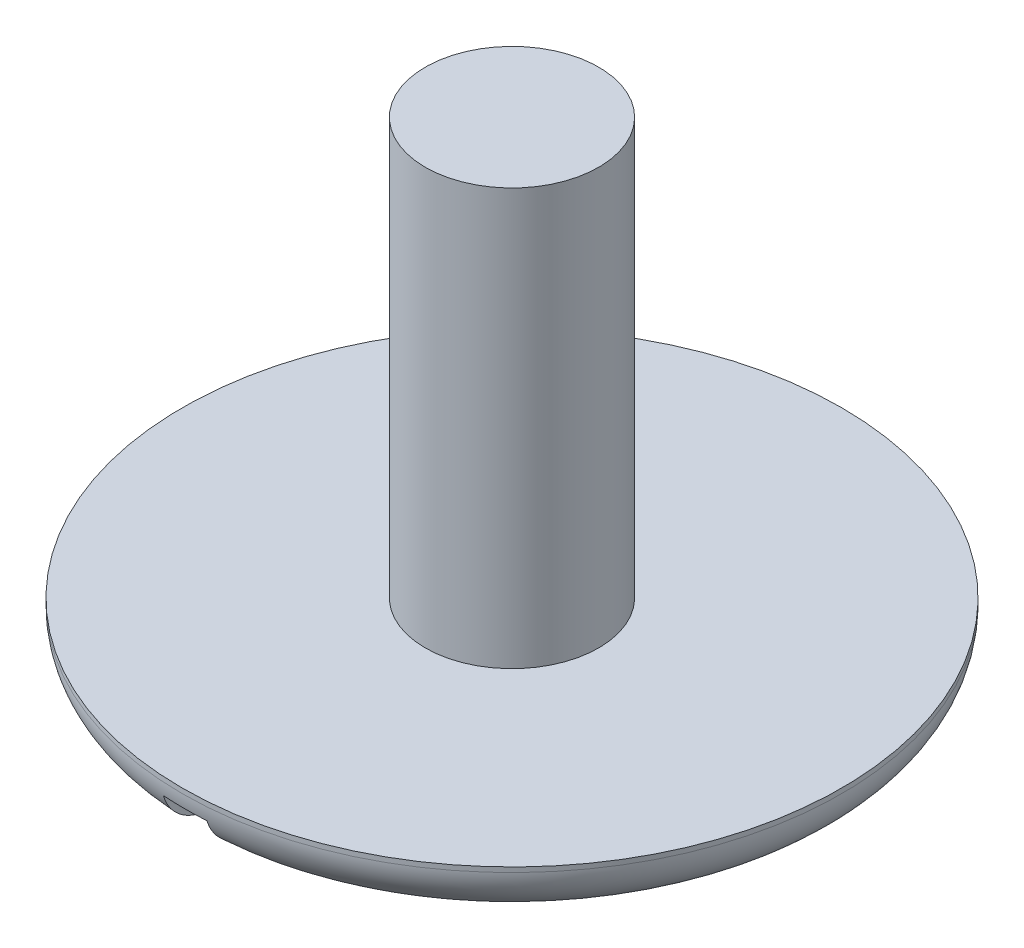
ISO-10303-21;
HEADER;
FILE_DESCRIPTION(('STEP AP214'),'2;1');
FILE_NAME('part.step','',(''),(''),'','','');
FILE_SCHEMA(('AUTOMOTIVE_DESIGN { 1 0 10303 214 1 1 1 1 }'));
ENDSEC;
DATA;
#1=APPLICATION_CONTEXT('core data for automotive mechanical design processes');
#2=APPLICATION_PROTOCOL_DEFINITION('international standard','automotive_design',2000,#1);
#3=PRODUCT_CONTEXT('',#1,'mechanical');
#4=PRODUCT('Part','Part','',(#3));
#5=PRODUCT_RELATED_PRODUCT_CATEGORY('part','',(#4));
#6=PRODUCT_DEFINITION_FORMATION('','',#4);
#7=PRODUCT_DEFINITION_CONTEXT('part definition',#1,'design');
#8=PRODUCT_DEFINITION('design','',#6,#7);
#9=PRODUCT_DEFINITION_SHAPE('','',#8);
#10=(LENGTH_UNIT() NAMED_UNIT(*) SI_UNIT(.MILLI.,.METRE.));
#11=(NAMED_UNIT(*) PLANE_ANGLE_UNIT() SI_UNIT($,.RADIAN.));
#12=(NAMED_UNIT(*) SI_UNIT($,.STERADIAN.) SOLID_ANGLE_UNIT());
#13=UNCERTAINTY_MEASURE_WITH_UNIT(LENGTH_MEASURE(1.E-05),#10,'distance_accuracy_value','');
#14=(GEOMETRIC_REPRESENTATION_CONTEXT(3) GLOBAL_UNCERTAINTY_ASSIGNED_CONTEXT((#13)) GLOBAL_UNIT_ASSIGNED_CONTEXT((#10,
#11,#12)) REPRESENTATION_CONTEXT('',''));
#15=CARTESIAN_POINT('',(0.,0.,0.));
#16=DIRECTION('',(0.,0.,1.));
#17=DIRECTION('',(1.,0.,0.));
#18=AXIS2_PLACEMENT_3D('',#15,#16,#17);
#19=CARTESIAN_POINT('',(0.,-0.77,0.));
#20=DIRECTION('',(0.,-1.,0.));
#21=DIRECTION('',(0.,0.,-1.));
#22=AXIS2_PLACEMENT_3D('',#19,#20,#21);
#23=PLANE('',#22);
#24=DIRECTION('',(0.,0.,-1.));
#25=VECTOR('',#24,1.);
#26=CARTESIAN_POINT('',(-0.315,-0.77,-4.89089266263106));
#27=LINE('',#26,#25);
#28=CARTESIAN_POINT('',(-0.315,-0.77,4.03773141751652));
#29=VERTEX_POINT('',#28);
#30=CARTESIAN_POINT('',(-0.315,-0.77,-4.03773141751652));
#31=VERTEX_POINT('',#30);
#32=EDGE_CURVE('E80',#29,#31,#27,.T.);
#33=ORIENTED_EDGE('',*,*,#32,.F.);
#34=CARTESIAN_POINT('',(0.,-0.77,0.));
#35=DIRECTION('',(0.,-1.,0.));
#36=DIRECTION('',(0.,0.,-1.));
#37=AXIS2_PLACEMENT_3D('',#34,#35,#36);
#38=CIRCLE('',#37,4.05);
#39=EDGE_CURVE('E87',#29,#31,#38,.T.);
#40=ORIENTED_EDGE('',*,*,#39,.T.);
#41=EDGE_LOOP('',(#33,#40));
#42=FACE_BOUND('',#41,.T.);
#43=ADVANCED_FACE('F34',(#42),#23,.T.);
#44=CARTESIAN_POINT('',(0.,6.,0.));
#45=DIRECTION('',(0.,-1.,0.));
#46=DIRECTION('',(0.,0.,-1.));
#47=AXIS2_PLACEMENT_3D('',#44,#45,#46);
#48=CYLINDRICAL_SURFACE('',#47,1.25);
#49=CARTESIAN_POINT('',(0.,6.,0.));
#50=DIRECTION('',(0.,1.,0.));
#51=DIRECTION('',(0.,0.,1.));
#52=AXIS2_PLACEMENT_3D('',#49,#50,#51);
#53=CIRCLE('',#52,1.25);
#54=CARTESIAN_POINT('',(0.,6.,1.25));
#55=VERTEX_POINT('',#54);
#56=EDGE_CURVE('E94',#55,#55,#53,.T.);
#57=ORIENTED_EDGE('',*,*,#56,.F.);
#58=EDGE_LOOP('',(#57));
#59=FACE_BOUND('',#58,.T.);
#60=CARTESIAN_POINT('',(0.,0.,0.));
#61=DIRECTION('',(0.,1.,0.));
#62=DIRECTION('',(0.,0.,1.));
#63=AXIS2_PLACEMENT_3D('',#60,#61,#62);
#64=CIRCLE('',#63,1.25);
#65=CARTESIAN_POINT('',(0.,0.,1.25));
#66=VERTEX_POINT('',#65);
#67=EDGE_CURVE('E99',#66,#66,#64,.T.);
#68=ORIENTED_EDGE('',*,*,#67,.T.);
#69=EDGE_LOOP('',(#68));
#70=FACE_BOUND('',#69,.T.);
#71=ADVANCED_FACE('F153',(#59,#70),#48,.T.);
#72=CARTESIAN_POINT('',(0.,6.,0.));
#73=DIRECTION('',(0.,1.,0.));
#74=DIRECTION('',(0.,0.,1.));
#75=AXIS2_PLACEMENT_3D('',#72,#73,#74);
#76=PLANE('',#75);
#77=ORIENTED_EDGE('',*,*,#56,.T.);
#78=EDGE_LOOP('',(#77));
#79=FACE_BOUND('',#78,.T.);
#80=ADVANCED_FACE('F149',(#79),#76,.T.);
#81=CARTESIAN_POINT('',(0.,-0.77,0.));
#82=DIRECTION('',(0.,1.,0.));
#83=DIRECTION('',(0.,0.,1.));
#84=AXIS2_PLACEMENT_3D('',#81,#82,#83);
#85=CYLINDRICAL_SURFACE('',#84,4.75);
#86=CARTESIAN_POINT('',(0.,-0.0700000000000001,0.));
#87=DIRECTION('',(0.,-1.,0.));
#88=DIRECTION('',(0.,0.,-1.));
#89=AXIS2_PLACEMENT_3D('',#86,#87,#88);
#90=CIRCLE('',#89,4.75);
#91=CARTESIAN_POINT('',(0.,-0.0700000000000001,-4.75));
#92=VERTEX_POINT('',#91);
#93=EDGE_CURVE('E97',#92,#92,#90,.F.);
#94=ORIENTED_EDGE('',*,*,#93,.T.);
#95=EDGE_LOOP('',(#94));
#96=FACE_BOUND('',#95,.T.);
#97=CARTESIAN_POINT('',(0.,0.,0.));
#98=DIRECTION('',(0.,-1.,0.));
#99=DIRECTION('',(0.,0.,-1.));
#100=AXIS2_PLACEMENT_3D('',#97,#98,#99);
#101=CIRCLE('',#100,4.75);
#102=CARTESIAN_POINT('',(0.,0.,-4.75));
#103=VERTEX_POINT('',#102);
#104=EDGE_CURVE('E132',#103,#103,#101,.T.);
#105=ORIENTED_EDGE('',*,*,#104,.T.);
#106=EDGE_LOOP('',(#105));
#107=FACE_BOUND('',#106,.T.);
#108=ADVANCED_FACE('F142',(#96,#107),#85,.T.);
#109=DIRECTION('',(0.,0.,1.));
#110=VECTOR('',#109,1.);
#111=CARTESIAN_POINT('',(0.315,-0.77,-4.89089266263106));
#112=LINE('',#111,#110);
#113=CARTESIAN_POINT('',(0.315,-0.77,-4.03773141751652));
#114=VERTEX_POINT('',#113);
#115=CARTESIAN_POINT('',(0.315,-0.77,4.03773141751652));
#116=VERTEX_POINT('',#115);
#117=EDGE_CURVE('E88',#114,#116,#112,.T.);
#118=ORIENTED_EDGE('',*,*,#117,.F.);
#119=EDGE_CURVE('E93',#114,#116,#38,.T.);
#120=ORIENTED_EDGE('',*,*,#119,.T.);
#121=EDGE_LOOP('',(#118,#120));
#122=FACE_BOUND('',#121,.T.);
#123=ADVANCED_FACE('F139',(#122),#23,.T.);
#124=CARTESIAN_POINT('',(0.,0.,0.));
#125=DIRECTION('',(0.,-1.,0.));
#126=DIRECTION('',(0.,0.,-1.));
#127=AXIS2_PLACEMENT_3D('',#124,#125,#126);
#128=PLANE('',#127);
#129=ORIENTED_EDGE('',*,*,#67,.F.);
#130=EDGE_LOOP('',(#129));
#131=FACE_BOUND('',#130,.T.);
#132=ORIENTED_EDGE('',*,*,#104,.F.);
#133=EDGE_LOOP('',(#132));
#134=FACE_BOUND('',#133,.T.);
#135=ADVANCED_FACE('F141',(#131,#134),#128,.F.);
#136=CARTESIAN_POINT('',(0.,-0.0700000000000001,0.));
#137=DIRECTION('',(0.,-1.,0.));
#138=DIRECTION('',(0.,0.,-1.));
#139=AXIS2_PLACEMENT_3D('',#136,#137,#138);
#140=TOROIDAL_SURFACE('',#139,4.05,0.7);
#141=CARTESIAN_POINT('',(-0.315,-0.42283056338766,3.43099553360957));
#142=CARTESIAN_POINT('',(-0.315,-0.389009256515311,3.41117635726926));
#143=CARTESIAN_POINT('',(-0.315,-0.353494176154245,3.39419236356587));
#144=CARTESIAN_POINT('',(-0.315,-0.280088408136934,3.36641177138425));
#145=CARTESIAN_POINT('',(-0.315,-0.242195021393654,3.35562234916811));
#146=CARTESIAN_POINT('',(-0.315,-0.165144203486631,3.34056881820007));
#147=CARTESIAN_POINT('',(-0.315,-0.125987246125714,3.33630229192498));
#148=CARTESIAN_POINT('',(-0.315,-0.0475238762300645,3.33441545549966));
#149=CARTESIAN_POINT('',(-0.315,-0.00821750239286478,3.33679352789955));
#150=CARTESIAN_POINT('',(-0.315,0.0693880232314119,3.34811463246769));
#151=CARTESIAN_POINT('',(-0.315,0.107688365538593,3.35704950596618));
#152=CARTESIAN_POINT('',(-0.315,0.182249796707662,3.38121462641381));
#153=CARTESIAN_POINT('',(-0.315,0.218510800616931,3.39644513539959));
#154=CARTESIAN_POINT('',(-0.315,0.288017028597836,3.43278387151255));
#155=CARTESIAN_POINT('',(-0.315,0.321258253963292,3.45389974567671));
#156=CARTESIAN_POINT('',(-0.315,0.383740870037022,3.50139314495137));
#157=CARTESIAN_POINT('',(-0.315,0.412982193198926,3.5277707588984));
#158=CARTESIAN_POINT('',(-0.315,0.466751005795269,3.58514230058662));
#159=CARTESIAN_POINT('',(-0.315,0.49126069117625,3.61615291399784));
#160=CARTESIAN_POINT('',(-0.315,0.534748798281029,3.6818361981447));
#161=CARTESIAN_POINT('',(-0.315,0.553727114345321,3.71650893881658));
#162=CARTESIAN_POINT('',(-0.315,0.585683854867248,3.78867019799686));
#163=CARTESIAN_POINT('',(-0.315,0.598639965756056,3.82616859940409));
#164=CARTESIAN_POINT('',(-0.315,0.61808578267529,3.90280636448875));
#165=CARTESIAN_POINT('',(-0.315,0.624575403302755,3.94194574983156));
#166=CARTESIAN_POINT('',(-0.315,0.630909994065656,4.02082986962436));
#167=CARTESIAN_POINT('',(-0.315,0.63074299417132,4.06057556609924));
#168=CARTESIAN_POINT('',(-0.315,0.623735584528529,4.13947448229391));
#169=CARTESIAN_POINT('',(-0.315,0.616895176416819,4.17862770215902));
#170=CARTESIAN_POINT('',(-0.315,0.596734052024424,4.25520926998298));
#171=CARTESIAN_POINT('',(-0.315,0.583416373601301,4.29263841753684));
#172=CARTESIAN_POINT('',(-0.315,0.550673741157529,4.36472288034668));
#173=CARTESIAN_POINT('',(-0.315,0.531248842083483,4.39937822055505));
#174=CARTESIAN_POINT('',(-0.315,0.486883645367827,4.46485563961799));
#175=CARTESIAN_POINT('',(-0.315,0.461954543775371,4.49568530419688));
#176=CARTESIAN_POINT('',(-0.315,0.407262475855515,4.55270858471463));
#177=CARTESIAN_POINT('',(-0.315,0.377499572986789,4.57890226150581));
#178=CARTESIAN_POINT('',(-0.315,0.3140649137722,4.62584067179907));
#179=CARTESIAN_POINT('',(-0.315,0.280403129148378,4.64659888173326));
#180=CARTESIAN_POINT('',(-0.315,0.210066703427984,4.68215549764315));
#181=CARTESIAN_POINT('',(-0.315,0.17339209877301,4.69695397569207));
#182=CARTESIAN_POINT('',(-0.315,0.0981540121538635,4.72014033582663));
#183=CARTESIAN_POINT('',(-0.315,0.0595946548185482,4.72854160325344));
#184=CARTESIAN_POINT('',(-0.315,-0.0183875106606548,4.73874320632799));
#185=CARTESIAN_POINT('',(-0.315,-0.057810311922345,4.74054359456969));
#186=CARTESIAN_POINT('',(-0.315,-0.13635305708245,4.73749347050033));
#187=CARTESIAN_POINT('',(-0.315,-0.17547329219419,4.73265045038413));
#188=CARTESIAN_POINT('',(-0.315,-0.252345417192459,4.71646590366597));
#189=CARTESIAN_POINT('',(-0.315,-0.290097308946281,4.70512438593246));
#190=CARTESIAN_POINT('',(-0.315,-0.363166327221757,4.67626663209913));
#191=CARTESIAN_POINT('',(-0.315,-0.398483215505447,4.65874979283494));
#192=CARTESIAN_POINT('',(-0.315,-0.46567990677638,4.61804288495799));
#193=CARTESIAN_POINT('',(-0.315,-0.497559697090338,4.59485279542784));
#194=CARTESIAN_POINT('',(-0.315,-0.557023217026364,4.54342740642572));
#195=CARTESIAN_POINT('',(-0.315,-0.584601316888844,4.51518559761341));
#196=CARTESIAN_POINT('',(-0.315,-0.634637218957719,4.45448170044525));
#197=CARTESIAN_POINT('',(-0.315,-0.657094958544942,4.42201956048471));
#198=CARTESIAN_POINT('',(-0.315,-0.696306247307126,4.35372081965682));
#199=CARTESIAN_POINT('',(-0.315,-0.71304714818336,4.31787695744718));
#200=CARTESIAN_POINT('',(-0.315,-0.740290614589194,4.24389211788064));
#201=CARTESIAN_POINT('',(-0.315,-0.750793081960816,4.20575110438983));
#202=CARTESIAN_POINT('',(-0.315,-0.765288328748437,4.12815234564138));
#203=CARTESIAN_POINT('',(-0.315,-0.769264702234419,4.08869153560261));
#204=CARTESIAN_POINT('',(-0.315,-0.770549262087883,4.00966292274927));
#205=CARTESIAN_POINT('',(-0.315,-0.767857622970012,3.9700951227619));
#206=CARTESIAN_POINT('',(-0.315,-0.755874625714613,3.89190069833926));
#207=CARTESIAN_POINT('',(-0.315,-0.746571696832174,3.85327584696794));
#208=CARTESIAN_POINT('',(-0.315,-0.721611556801678,3.7781249529511));
#209=CARTESIAN_POINT('',(-0.315,-0.705952739423361,3.74159944350705));
#210=CARTESIAN_POINT('',(-0.315,-0.668712225505314,3.6716773389339));
#211=CARTESIAN_POINT('',(-0.315,-0.64712667069198,3.63828280111324));
#212=CARTESIAN_POINT('',(-0.315,-0.598657960084988,3.57563310208455));
#213=CARTESIAN_POINT('',(-0.315,-0.57178123965476,3.54637298593141));
#214=CARTESIAN_POINT('',(-0.315,-0.52432864723758,3.5027567603944));
#215=CARTESIAN_POINT('',(-0.315,-0.50511140665627,3.48689711384984));
#216=CARTESIAN_POINT('',(-0.315,-0.465100621939307,3.45730908469555));
#217=CARTESIAN_POINT('',(-0.315,-0.444307078088787,3.4435807017003));
#218=CARTESIAN_POINT('',(-0.315,-0.42283056338766,3.43099553360957));
#219=B_SPLINE_CURVE_WITH_KNOTS('',3,(#141,#142,#143,#144,#145,#146,#147,#148,#149,#150,#151,
#152,#153,#154,#155,#156,#157,#158,#159,#160,#161,#162,#163,#164,#165,#166,#167,#168,#169,#170,
#171,#172,#173,#174,#175,#176,#177,#178,#179,#180,#181,#182,#183,#184,#185,#186,#187,#188,#189,
#190,#191,#192,#193,#194,#195,#196,#197,#198,#199,#200,#201,#202,#203,#204,#205,#206,#207,#208,
#209,#210,#211,#212,#213,#214,#215,#216,#217,#218),.UNSPECIFIED.,.T.,.F.,(4,2,2,2,2,2,2,2,2,2,2,
2,2,2,2,2,2,2,2,2,2,2,2,2,2,2,2,2,2,2,2,2,2,2,2,2,2,2,4),(0.,0.117511039318565,
0.235157939079562,0.352761225832271,0.470335887703578,0.58776449820064,0.705197996797754,
0.822784797460496,0.940373583567082,1.05839655505447,1.17642178085377,1.29488089648368,
1.41334157658285,1.53201528395667,1.65068896222414,1.7693070358037,1.88792404220818,
2.00630195791124,2.12467831966164,2.24275834462702,2.36083694156438,2.47866779011555,
2.5964976998214,2.71419483442342,2.83189180840533,2.94960028143209,3.06730918845928,
3.18517087523955,3.3030340033257,3.42115623499194,3.53928032519083,3.65770091489596,
3.77611840534044,3.89474365610015,4.01339890395885,4.13213157962947,4.25072072940832,
4.32534020019059,4.39995965747517),.UNSPECIFIED.);
#220=CARTESIAN_POINT('',(-0.315,-0.27,4.71029937321658));
#221=VERTEX_POINT('',#220);
#222=EDGE_CURVE('E11',#221,#29,#219,.T.);
#223=ORIENTED_EDGE('',*,*,#222,.F.);
#224=CARTESIAN_POINT('',(0.,-0.27,0.));
#225=DIRECTION('',(0.,-1.,0.));
#226=DIRECTION('',(0.,0.,-1.));
#227=AXIS2_PLACEMENT_3D('',#224,#225,#226);
#228=CIRCLE('',#227,4.72082039324994);
#229=CARTESIAN_POINT('',(0.315,-0.27,4.71029937321658));
#230=VERTEX_POINT('',#229);
#231=EDGE_CURVE('E108',#221,#230,#228,.F.);
#232=ORIENTED_EDGE('',*,*,#231,.T.);
#233=CARTESIAN_POINT('',(0.315,-0.42283056338766,3.43099553360957));
#234=CARTESIAN_POINT('',(0.315,-0.456834783806486,3.45092596286414));
#235=CARTESIAN_POINT('',(0.315,-0.489176092582904,3.4737517315327));
#236=CARTESIAN_POINT('',(0.315,-0.54958981648919,3.52453350156372));
#237=CARTESIAN_POINT('',(0.315,-0.577656833130591,3.55249589385829));
#238=CARTESIAN_POINT('',(0.315,-0.628687028730963,3.61271681826876));
#239=CARTESIAN_POINT('',(0.315,-0.651653443444183,3.64497260581755));
#240=CARTESIAN_POINT('',(0.315,-0.691854361226438,3.71286491370177));
#241=CARTESIAN_POINT('',(0.315,-0.709090295913084,3.74850058679343));
#242=CARTESIAN_POINT('',(0.315,-0.737396447738483,3.82224901351485));
#243=CARTESIAN_POINT('',(0.315,-0.748450478433904,3.86036798096668));
#244=CARTESIAN_POINT('',(0.315,-0.764012973691147,3.93792120482449));
#245=CARTESIAN_POINT('',(0.315,-0.768521106654178,3.97735552775958));
#246=CARTESIAN_POINT('',(0.315,-0.770863617744841,4.05647879120232));
#247=CARTESIAN_POINT('',(0.315,-0.768688440015887,4.09616801524105));
#248=CARTESIAN_POINT('',(0.315,-0.757700621314823,4.17461696595724));
#249=CARTESIAN_POINT('',(0.315,-0.748888003198914,4.21337669583496));
#250=CARTESIAN_POINT('',(0.315,-0.724878614035216,4.28883349165848));
#251=CARTESIAN_POINT('',(0.315,-0.70968670626329,4.32553210479229));
#252=CARTESIAN_POINT('',(0.315,-0.673344396489738,4.39584996418219));
#253=CARTESIAN_POINT('',(0.315,-0.652194065937754,4.42946924735723));
#254=CARTESIAN_POINT('',(0.315,-0.604583024053005,4.49259593115343));
#255=CARTESIAN_POINT('',(0.315,-0.578133857167958,4.52211203848184));
#256=CARTESIAN_POINT('',(0.315,-0.520644470248019,4.57627114765077));
#257=CARTESIAN_POINT('',(0.315,-0.489604305828003,4.60091420851441));
#258=CARTESIAN_POINT('',(0.315,-0.423897395287192,4.64456303380058));
#259=CARTESIAN_POINT('',(0.315,-0.389239880891808,4.66358269555105));
#260=CARTESIAN_POINT('',(0.315,-0.317219016157882,4.69552022011585));
#261=CARTESIAN_POINT('',(0.315,-0.279855698534869,4.70843815669117));
#262=CARTESIAN_POINT('',(0.315,-0.203563491991091,4.72778087114088));
#263=CARTESIAN_POINT('',(0.315,-0.164637850047431,4.73421845733277));
#264=CARTESIAN_POINT('',(0.315,-0.0862583990935499,4.74046029561905));
#265=CARTESIAN_POINT('',(0.315,-0.0468045937135397,4.74026459328245));
#266=CARTESIAN_POINT('',(0.315,0.0314714757289719,4.73324893733137));
#267=CARTESIAN_POINT('',(0.315,0.0702943054669691,4.72643529262582));
#268=CARTESIAN_POINT('',(0.315,0.146245439690619,4.70638864583639));
#269=CARTESIAN_POINT('',(0.315,0.183373745594615,4.69315564912572));
#270=CARTESIAN_POINT('',(0.315,0.254894632810012,4.66064480632602));
#271=CARTESIAN_POINT('',(0.315,0.289286430600879,4.64136523672687));
#272=CARTESIAN_POINT('',(0.315,0.354351250070472,4.59731380186659));
#273=CARTESIAN_POINT('',(0.315,0.385024250472256,4.57254190518363));
#274=CARTESIAN_POINT('',(0.315,0.441830303066857,4.51817206443698));
#275=CARTESIAN_POINT('',(0.315,0.467956663009209,4.48856712864345));
#276=CARTESIAN_POINT('',(0.315,0.514881786611838,4.42539980638404));
#277=CARTESIAN_POINT('',(0.315,0.535680491722804,4.39183737643242));
#278=CARTESIAN_POINT('',(0.315,0.57141147671434,4.3216260051341));
#279=CARTESIAN_POINT('',(0.315,0.586330209101221,4.28497016956108));
#280=CARTESIAN_POINT('',(0.315,0.609818923629519,4.20967796311197));
#281=CARTESIAN_POINT('',(0.315,0.618388814536365,4.17104156378317));
#282=CARTESIAN_POINT('',(0.315,0.62895741140941,4.09278323288042));
#283=CARTESIAN_POINT('',(0.315,0.630939883541878,4.05315910868188));
#284=CARTESIAN_POINT('',(0.315,0.628236398465487,3.9741389133092));
#285=CARTESIAN_POINT('',(0.315,0.623550367607424,3.93474284465861));
#286=CARTESIAN_POINT('',(0.315,0.60763012356204,3.85722780874904));
#287=CARTESIAN_POINT('',(0.315,0.596384980420541,3.81911108575107));
#288=CARTESIAN_POINT('',(0.315,0.567654362088342,3.74530641816908));
#289=CARTESIAN_POINT('',(0.315,0.550168852725846,3.70961848688621));
#290=CARTESIAN_POINT('',(0.315,0.509451383835538,3.64169387417888));
#291=CARTESIAN_POINT('',(0.315,0.48622030579491,3.60945666442952));
#292=CARTESIAN_POINT('',(0.315,0.434663364147652,3.54935184968678));
#293=CARTESIAN_POINT('',(0.315,0.406337544510926,3.52148420698596));
#294=CARTESIAN_POINT('',(0.315,0.345466356279102,3.47098652589245));
#295=CARTESIAN_POINT('',(0.315,0.312931486310395,3.44834383352314));
#296=CARTESIAN_POINT('',(0.315,0.244511285899958,3.40886825742226));
#297=CARTESIAN_POINT('',(0.315,0.208626164410345,3.39203501166798));
#298=CARTESIAN_POINT('',(0.315,0.134678857253756,3.36472635517999));
#299=CARTESIAN_POINT('',(0.315,0.0966260794952983,3.35422546579326));
#300=CARTESIAN_POINT('',(0.315,0.0192849176618627,3.33978213095798));
#301=CARTESIAN_POINT('',(0.315,-0.0200037474484819,3.33584118835886));
#302=CARTESIAN_POINT('',(0.315,-0.0985721215064932,3.33463830952893));
#303=CARTESIAN_POINT('',(0.315,-0.137851564625942,3.3373582513094));
#304=CARTESIAN_POINT('',(0.315,-0.215361075908268,3.3493599121391));
#305=CARTESIAN_POINT('',(0.315,-0.253592362485824,3.35863364490846));
#306=CARTESIAN_POINT('',(0.315,-0.313730546541368,3.37870240197656));
#307=CARTESIAN_POINT('',(0.315,-0.336300623634624,3.38756712793631));
#308=CARTESIAN_POINT('',(0.315,-0.380400074987335,3.40758845432953));
#309=CARTESIAN_POINT('',(0.315,-0.401929451290585,3.41874505026186));
#310=CARTESIAN_POINT('',(0.315,-0.42283056338766,3.43099553360957));
#311=B_SPLINE_CURVE_WITH_KNOTS('',3,(#233,#234,#235,#236,#237,#238,#239,#240,#241,#242,#243,
#244,#245,#246,#247,#248,#249,#250,#251,#252,#253,#254,#255,#256,#257,#258,#259,#260,#261,#262,
#263,#264,#265,#266,#267,#268,#269,#270,#271,#272,#273,#274,#275,#276,#277,#278,#279,#280,#281,
#282,#283,#284,#285,#286,#287,#288,#289,#290,#291,#292,#293,#294,#295,#296,#297,#298,#299,#300,
#301,#302,#303,#304,#305,#306,#307,#308,#309,#310),.UNSPECIFIED.,.T.,.F.,(4,2,2,2,2,2,2,2,2,2,2,
2,2,2,2,2,2,2,2,2,2,2,2,2,2,2,2,2,2,2,2,2,2,2,2,2,2,2,4),(0.,0.11815486525204,0.23645774564516,
0.354685360512035,0.472883416923026,0.591389526380136,0.709901638850655,0.828583279799338,
0.947264512066524,1.06585543103422,1.18444492799506,1.30277881289819,1.42111126443416,
1.53914878385859,1.6571848763443,1.77498721143597,1.89278873725539,2.01047807255578,
2.12816730934655,2.2458901227147,2.36361360959715,2.48150893573346,2.59940555744805,
2.71757224764808,2.83574063590249,2.95420001959865,3.07266071161051,3.19131937004481,
3.30997867825537,3.42861979299338,3.54725988385448,3.66560955949967,3.78395185870888,
3.90181476644543,4.01970467224228,4.13727419642503,4.25470069991923,4.32732618296604,
4.39995152338056),.UNSPECIFIED.);
#312=EDGE_CURVE('E47',#116,#230,#311,.T.);
#313=ORIENTED_EDGE('',*,*,#312,.F.);
#314=ORIENTED_EDGE('',*,*,#119,.F.);
#315=CARTESIAN_POINT('',(0.315,-0.585154818558936,-4.51295619944407));
#316=CARTESIAN_POINT('',(0.315,-0.611823888575156,-4.48389454538117));
#317=CARTESIAN_POINT('',(0.315,-0.636053705903508,-4.45255480023926));
#318=CARTESIAN_POINT('',(0.315,-0.678923594907662,-4.38622335663345));
#319=CARTESIAN_POINT('',(0.315,-0.697556731204374,-4.3512271989157));
#320=CARTESIAN_POINT('',(0.315,-0.728676664280023,-4.27862189383551));
#321=CARTESIAN_POINT('',(0.315,-0.741167039785534,-4.24101428249645));
#322=CARTESIAN_POINT('',(0.315,-0.759665167304573,-4.16424851421748));
#323=CARTESIAN_POINT('',(0.315,-0.765674527583296,-4.12509074445123));
#324=CARTESIAN_POINT('',(0.315,-0.771058291155358,-4.04624908308169));
#325=CARTESIAN_POINT('',(0.315,-0.770420470021974,-4.00656435623006));
#326=CARTESIAN_POINT('',(0.315,-0.762501302469801,-3.92786163234335));
#327=CARTESIAN_POINT('',(0.315,-0.755219618183292,-3.88884366931877));
#328=CARTESIAN_POINT('',(0.315,-0.734203687066534,-3.81252802684404));
#329=CARTESIAN_POINT('',(0.315,-0.720460605748156,-3.77523277972871));
#330=CARTESIAN_POINT('',(0.315,-0.686904764871393,-3.7034805161418));
#331=CARTESIAN_POINT('',(0.315,-0.66709201014681,-3.66902349740994));
#332=CARTESIAN_POINT('',(0.315,-0.621966721883074,-3.60395155853939));
#333=CARTESIAN_POINT('',(0.315,-0.596657476247694,-3.57333435868667));
#334=CARTESIAN_POINT('',(0.315,-0.541244671965801,-3.51679863662253));
#335=CARTESIAN_POINT('',(0.315,-0.511141187157326,-3.4908800420591));
#336=CARTESIAN_POINT('',(0.315,-0.447084599652005,-3.44456018727342));
#337=CARTESIAN_POINT('',(0.315,-0.413142808891089,-3.4241432850065));
#338=CARTESIAN_POINT('',(0.315,-0.342302744824016,-3.38932416797436));
#339=CARTESIAN_POINT('',(0.315,-0.30540453895779,-3.37492181605544));
#340=CARTESIAN_POINT('',(0.315,-0.229857523776281,-3.35260006503803));
#341=CARTESIAN_POINT('',(0.315,-0.191216312952,-3.34465494680663));
#342=CARTESIAN_POINT('',(0.315,-0.113148038743195,-3.33538483491312));
#343=CARTESIAN_POINT('',(0.315,-0.0737209908094392,-3.33405971122036));
#344=CARTESIAN_POINT('',(0.315,0.00468437902828041,-3.33806278432002));
#345=CARTESIAN_POINT('',(0.315,0.0436636379575473,-3.34337266019925));
#346=CARTESIAN_POINT('',(0.315,0.120177752120188,-3.36045889357173));
#347=CARTESIAN_POINT('',(0.315,0.157712609132661,-3.37223524309982));
#348=CARTESIAN_POINT('',(0.315,0.230291669130206,-3.40191725624418));
#349=CARTESIAN_POINT('',(0.315,0.265334887500686,-3.41982532683858));
#350=CARTESIAN_POINT('',(0.315,0.331930676559868,-3.46125226504432));
#351=CARTESIAN_POINT('',(0.315,0.363483192045612,-3.48477122136922));
#352=CARTESIAN_POINT('',(0.315,0.422313294400359,-3.53683177556871));
#353=CARTESIAN_POINT('',(0.315,0.449576667557874,-3.56538943439097));
#354=CARTESIAN_POINT('',(0.315,0.498944956002778,-3.62666094998804));
#355=CARTESIAN_POINT('',(0.315,0.521049759773784,-3.65937489658859));
#356=CARTESIAN_POINT('',(0.315,0.559562791397776,-3.72816892961275));
#357=CARTESIAN_POINT('',(0.315,0.575948348876085,-3.76426170867552));
#358=CARTESIAN_POINT('',(0.315,0.602444348148001,-3.83868153173986));
#359=CARTESIAN_POINT('',(0.315,0.612554694941312,-3.87700860955682));
#360=CARTESIAN_POINT('',(0.315,0.626233075285518,-3.95490916687599));
#361=CARTESIAN_POINT('',(0.315,0.629785191170056,-3.99448544240516));
#362=CARTESIAN_POINT('',(0.315,0.630195868751169,-4.07367294763435));
#363=CARTESIAN_POINT('',(0.315,0.627054404844606,-4.1132841774675));
#364=CARTESIAN_POINT('',(0.315,0.614161373088388,-4.19142123364427));
#365=CARTESIAN_POINT('',(0.315,0.604408995860333,-4.22994692648327));
#366=CARTESIAN_POINT('',(0.315,0.578563847584417,-4.30480959571959));
#367=CARTESIAN_POINT('',(0.315,0.562471127936586,-4.34114658985756));
#368=CARTESIAN_POINT('',(0.315,0.524428999228645,-4.41053345606353));
#369=CARTESIAN_POINT('',(0.315,0.502489536958027,-4.44358878120345));
#370=CARTESIAN_POINT('',(0.315,0.453359599117249,-4.5055351401881));
#371=CARTESIAN_POINT('',(0.315,0.426169179759116,-4.53442621860573));
#372=CARTESIAN_POINT('',(0.315,0.367381201206362,-4.58714777169596));
#373=CARTESIAN_POINT('',(0.315,0.33579470123591,-4.61099057813924));
#374=CARTESIAN_POINT('',(0.315,0.269059569733422,-4.65302052056033));
#375=CARTESIAN_POINT('',(0.315,0.233910976663255,-4.67120771759623));
#376=CARTESIAN_POINT('',(0.315,0.161135299605625,-4.70136810057551));
#377=CARTESIAN_POINT('',(0.315,0.123514005543906,-4.71335525824096));
#378=CARTESIAN_POINT('',(0.315,0.0467929764616496,-4.73083263174966));
#379=CARTESIAN_POINT('',(0.315,0.00769331359863501,-4.73632316426454));
#380=CARTESIAN_POINT('',(0.315,-0.0708115545099843,-4.74064708827613));
#381=CARTESIAN_POINT('',(0.315,-0.110216196683998,-4.7394907157487));
#382=CARTESIAN_POINT('',(0.315,-0.18828223802804,-4.73057592657846));
#383=CARTESIAN_POINT('',(0.315,-0.226943451890246,-4.72281588516327));
#384=CARTESIAN_POINT('',(0.315,-0.302419666106968,-4.70091533917847));
#385=CARTESIAN_POINT('',(0.315,-0.339234245007868,-4.68677338537429));
#386=CARTESIAN_POINT('',(0.315,-0.409936108731424,-4.65252213033063));
#387=CARTESIAN_POINT('',(0.315,-0.443826866137179,-4.63242003742385));
#388=CARTESIAN_POINT('',(0.315,-0.495627498932129,-4.59548685571298));
#389=CARTESIAN_POINT('',(0.315,-0.514730264270405,-4.58029831327891));
#390=CARTESIAN_POINT('',(0.315,-0.551250993542515,-4.54801541989507));
#391=CARTESIAN_POINT('',(0.315,-0.568668957968511,-4.53092106950203));
#392=CARTESIAN_POINT('',(0.315,-0.585154818558936,-4.51295619944407));
#393=B_SPLINE_CURVE_WITH_KNOTS('',3,(#315,#316,#317,#318,#319,#320,#321,#322,#323,#324,#325,
#326,#327,#328,#329,#330,#331,#332,#333,#334,#335,#336,#337,#338,#339,#340,#341,#342,#343,#344,
#345,#346,#347,#348,#349,#350,#351,#352,#353,#354,#355,#356,#357,#358,#359,#360,#361,#362,#363,
#364,#365,#366,#367,#368,#369,#370,#371,#372,#373,#374,#375,#376,#377,#378,#379,#380,#381,#382,
#383,#384,#385,#386,#387,#388,#389,#390,#391,#392),.UNSPECIFIED.,.T.,.F.,(4,2,2,2,2,2,2,2,2,2,2,
2,2,2,2,2,2,2,2,2,2,2,2,2,2,2,2,2,2,2,2,2,2,2,2,2,2,2,4),(0.,0.118242336894484,
0.236630600254687,0.354949809549135,0.473239651148164,0.591747070725197,0.710260517226995,
0.828936477202597,0.947612342666571,1.06621741290418,1.18482065663325,1.30308304988106,
1.42134274616716,1.53912907384642,1.65691308794499,1.77437258806906,1.89183194351125,
2.0093374600298,2.12684483454812,2.24473376494957,2.36262524360201,2.48097885937777,
2.59933426686295,2.71797656234195,2.83661931163201,2.95527658905481,3.07393290456396,
3.19238863023841,3.31084308790262,3.42900476214856,3.54716516067414,3.66505811298802,
3.78294531848849,3.90065103095224,4.01838571220677,4.13614714266847,4.25376672663639,
4.32685991099487,4.39995307400142),.UNSPECIFIED.);
#394=CARTESIAN_POINT('',(0.315,-0.27,-4.71029937321658));
#395=VERTEX_POINT('',#394);
#396=EDGE_CURVE('E107',#395,#114,#393,.T.);
#397=ORIENTED_EDGE('',*,*,#396,.F.);
#398=CARTESIAN_POINT('',(-0.315,-0.27,-4.71029937321658));
#399=VERTEX_POINT('',#398);
#400=EDGE_CURVE('E105',#395,#399,#228,.F.);
#401=ORIENTED_EDGE('',*,*,#400,.T.);
#402=CARTESIAN_POINT('',(-0.315,-0.585154818558936,-4.51295619944407));
#403=CARTESIAN_POINT('',(-0.315,-0.558577265495364,-4.54191295884126));
#404=CARTESIAN_POINT('',(-0.315,-0.529539220071679,-4.56864966947221));
#405=CARTESIAN_POINT('',(-0.315,-0.46736372790375,-4.61689227025993));
#406=CARTESIAN_POINT('',(-0.315,-0.434221503180102,-4.63839197561691));
#407=CARTESIAN_POINT('',(-0.315,-0.364805779111452,-4.67551091084833));
#408=CARTESIAN_POINT('',(-0.315,-0.328533525040372,-4.69113246619029));
#409=CARTESIAN_POINT('',(-0.315,-0.253888598419282,-4.71605105025281));
#410=CARTESIAN_POINT('',(-0.315,-0.21551644454584,-4.72534963320123));
#411=CARTESIAN_POINT('',(-0.315,-0.13779842813044,-4.73735516284805));
#412=CARTESIAN_POINT('',(-0.315,-0.0984537067109401,-4.74006949561092));
#413=CARTESIAN_POINT('',(-0.315,-0.0198661403117988,-4.73884976526744));
#414=CARTESIAN_POINT('',(-0.315,0.019376701270263,-4.73491548321857));
#415=CARTESIAN_POINT('',(-0.315,0.0966193983756325,-4.72051583875246));
#416=CARTESIAN_POINT('',(-0.315,0.134620022581075,-4.71005459891978));
#417=CARTESIAN_POINT('',(-0.315,0.208327138345527,-4.68290476157352));
#418=CARTESIAN_POINT('',(-0.315,0.244033631975175,-4.66621616968074));
#419=CARTESIAN_POINT('',(-0.315,0.312164832983331,-4.62707664832127));
#420=CARTESIAN_POINT('',(-0.315,0.344587440533886,-4.60462206391819));
#421=CARTESIAN_POINT('',(-0.315,0.40521084901469,-4.55459711581187));
#422=CARTESIAN_POINT('',(-0.315,0.433411626240692,-4.52702672338692));
#423=CARTESIAN_POINT('',(-0.315,0.48484494222471,-4.46750275509902));
#424=CARTESIAN_POINT('',(-0.315,0.50806874333878,-4.43554162959853));
#425=CARTESIAN_POINT('',(-0.315,0.548836027091414,-4.36818172355562));
#426=CARTESIAN_POINT('',(-0.315,0.566379434213843,-4.33278289731995));
#427=CARTESIAN_POINT('',(-0.315,0.595333374114317,-4.25946104638026));
#428=CARTESIAN_POINT('',(-0.315,0.606728963695112,-4.22153212084184));
#429=CARTESIAN_POINT('',(-0.315,0.623007225816615,-4.14430155492371));
#430=CARTESIAN_POINT('',(-0.315,0.627889809655103,-4.10499989585589));
#431=CARTESIAN_POINT('',(-0.315,0.631013207166087,-4.02604096561074));
#432=CARTESIAN_POINT('',(-0.315,0.629238403557434,-3.98638307624617));
#433=CARTESIAN_POINT('',(-0.315,0.619065006508818,-3.90792598571542));
#434=CARTESIAN_POINT('',(-0.315,0.610666343003578,-3.86912679363675));
#435=CARTESIAN_POINT('',(-0.315,0.587467410359692,-3.79343823166314));
#436=CARTESIAN_POINT('',(-0.315,0.572659123738654,-3.75655131866518));
#437=CARTESIAN_POINT('',(-0.315,0.537055358931494,-3.68578951504077));
#438=CARTESIAN_POINT('',(-0.315,0.516259880830721,-3.65191462437138));
#439=CARTESIAN_POINT('',(-0.315,0.469284754592748,-3.58817130054004));
#440=CARTESIAN_POINT('',(-0.315,0.443109411446846,-3.55829969531257));
#441=CARTESIAN_POINT('',(-0.315,0.386101523732115,-3.50339124327276));
#442=CARTESIAN_POINT('',(-0.315,0.355269047689885,-3.47835432533358));
#443=CARTESIAN_POINT('',(-0.315,0.289920283281538,-3.4339103457985));
#444=CARTESIAN_POINT('',(-0.315,0.255415470648415,-3.41448641213733));
#445=CARTESIAN_POINT('',(-0.315,0.183624899657115,-3.38173398699662));
#446=CARTESIAN_POINT('',(-0.315,0.146339208899179,-3.36840534740298));
#447=CARTESIAN_POINT('',(-0.315,0.0702052301923581,-3.34827597024607));
#448=CARTESIAN_POINT('',(-0.315,0.0313637839337272,-3.34144935251751));
#449=CARTESIAN_POINT('',(-0.315,-0.0469137640831538,-3.33443245766919));
#450=CARTESIAN_POINT('',(-0.315,-0.0863498553230079,-3.33424206330183));
#451=CARTESIAN_POINT('',(-0.315,-0.164591221273238,-3.34049495759711));
#452=CARTESIAN_POINT('',(-0.315,-0.203397842998001,-3.34692141077648));
#453=CARTESIAN_POINT('',(-0.315,-0.279382363150441,-3.36619402314468));
#454=CARTESIAN_POINT('',(-0.315,-0.316560262733242,-3.37904017778045));
#455=CARTESIAN_POINT('',(-0.315,-0.388262715149485,-3.41078945573422));
#456=CARTESIAN_POINT('',(-0.315,-0.422785439383629,-3.42969670778137));
#457=CARTESIAN_POINT('',(-0.315,-0.488181173985244,-3.47301998722876));
#458=CARTESIAN_POINT('',(-0.315,-0.519054116246847,-3.49743611740136));
#459=CARTESIAN_POINT('',(-0.315,-0.576387589910452,-3.55117111978338));
#460=CARTESIAN_POINT('',(-0.315,-0.602832756330159,-3.58050638510516));
#461=CARTESIAN_POINT('',(-0.315,-0.650445879860343,-3.64318564799375));
#462=CARTESIAN_POINT('',(-0.315,-0.67161371334127,-3.67652973944629));
#463=CARTESIAN_POINT('',(-0.315,-0.708155305554471,-3.74641998431614));
#464=CARTESIAN_POINT('',(-0.315,-0.723506255804957,-3.78297806410687));
#465=CARTESIAN_POINT('',(-0.315,-0.747867805279867,-3.85814761358346));
#466=CARTESIAN_POINT('',(-0.315,-0.756878560733688,-3.89675903264756));
#467=CARTESIAN_POINT('',(-0.315,-0.768319633608923,-3.97502913309945));
#468=CARTESIAN_POINT('',(-0.315,-0.77073587444985,-4.01468987256249));
#469=CARTESIAN_POINT('',(-0.315,-0.768875325441735,-4.09386505873761));
#470=CARTESIAN_POINT('',(-0.315,-0.764596861583652,-4.13337946638279));
#471=CARTESIAN_POINT('',(-0.315,-0.749459926391398,-4.21114067084567));
#472=CARTESIAN_POINT('',(-0.315,-0.738598740804727,-4.24938693790645));
#473=CARTESIAN_POINT('',(-0.315,-0.7106017234366,-4.32347357256928));
#474=CARTESIAN_POINT('',(-0.315,-0.693473490464054,-4.35931679185662));
#475=CARTESIAN_POINT('',(-0.315,-0.660915828114125,-4.41485373805596));
#476=CARTESIAN_POINT('',(-0.315,-0.647230107678137,-4.43558981002402));
#477=CARTESIAN_POINT('',(-0.315,-0.617741617125197,-4.47549777730552));
#478=CARTESIAN_POINT('',(-0.315,-0.601938848315429,-4.49466967358476));
#479=CARTESIAN_POINT('',(-0.315,-0.585154818558936,-4.51295619944407));
#480=B_SPLINE_CURVE_WITH_KNOTS('',3,(#402,#403,#404,#405,#406,#407,#408,#409,#410,#411,#412,
#413,#414,#415,#416,#417,#418,#419,#420,#421,#422,#423,#424,#425,#426,#427,#428,#429,#430,#431,
#432,#433,#434,#435,#436,#437,#438,#439,#440,#441,#442,#443,#444,#445,#446,#447,#448,#449,#450,
#451,#452,#453,#454,#455,#456,#457,#458,#459,#460,#461,#462,#463,#464,#465,#466,#467,#468,#469,
#470,#471,#472,#473,#474,#475,#476,#477,#478,#479),.UNSPECIFIED.,.T.,.F.,(4,2,2,2,2,2,2,2,2,2,2,
2,2,2,2,2,2,2,2,2,2,2,2,2,2,2,2,2,2,2,2,2,2,2,2,2,2,2,4),(0.,0.117823768995331,
0.235786018141556,0.353701550802264,0.471588088568107,0.589342322573633,0.707100434365793,
0.824784242476518,0.942467944366578,1.06022642831962,1.17798557342471,1.29594979442403,
1.4139155835956,1.53216682910981,1.65041968510027,1.76895011871467,1.88748180612661,
2.00616218941687,2.12484257101528,2.24342835124213,2.36201238672844,2.48023617174031,
2.5984570837916,2.71620544698617,2.83395172982281,2.95139916509937,3.06884651707842,
3.18637404305159,3.30390376177252,3.42183323140321,3.53976546345153,3.65815544679009,
3.77654251276663,3.89518208959112,4.01385133694964,4.13256954849866,4.25114428840086,
4.32555139657812,4.39995845881254),.UNSPECIFIED.);
#481=EDGE_CURVE('E92',#31,#399,#480,.T.);
#482=ORIENTED_EDGE('',*,*,#481,.F.);
#483=ORIENTED_EDGE('',*,*,#39,.F.);
#484=EDGE_LOOP('',(#223,#232,#313,#314,#397,#401,#482,#483));
#485=FACE_BOUND('',#484,.T.);
#486=ORIENTED_EDGE('',*,*,#93,.F.);
#487=EDGE_LOOP('',(#486));
#488=FACE_BOUND('',#487,.T.);
#489=ADVANCED_FACE('F36',(#485,#488),#140,.T.);
#490=CARTESIAN_POINT('',(-0.315,-0.27,-4.89089266263106));
#491=DIRECTION('',(-1.,0.,0.));
#492=DIRECTION('',(0.,0.,1.));
#493=AXIS2_PLACEMENT_3D('',#490,#491,#492);
#494=PLANE('',#493);
#495=ORIENTED_EDGE('',*,*,#481,.T.);
#496=DIRECTION('',(0.,0.,-1.));
#497=VECTOR('',#496,1.);
#498=CARTESIAN_POINT('',(-0.315,-0.27,-4.89089266263106));
#499=LINE('',#498,#497);
#500=EDGE_CURVE('E54',#221,#399,#499,.T.);
#501=ORIENTED_EDGE('',*,*,#500,.F.);
#502=ORIENTED_EDGE('',*,*,#222,.T.);
#503=ORIENTED_EDGE('',*,*,#32,.T.);
#504=EDGE_LOOP('',(#495,#501,#502,#503));
#505=FACE_BOUND('',#504,.T.);
#506=ADVANCED_FACE('F79',(#505),#494,.F.);
#507=CARTESIAN_POINT('',(0.315,-0.27,-4.89089266263106));
#508=DIRECTION('',(1.,0.,0.));
#509=DIRECTION('',(0.,0.,-1.));
#510=AXIS2_PLACEMENT_3D('',#507,#508,#509);
#511=PLANE('',#510);
#512=ORIENTED_EDGE('',*,*,#396,.T.);
#513=ORIENTED_EDGE('',*,*,#117,.T.);
#514=ORIENTED_EDGE('',*,*,#312,.T.);
#515=DIRECTION('',(0.,0.,1.));
#516=VECTOR('',#515,1.);
#517=CARTESIAN_POINT('',(0.315,-0.27,-4.89089266263106));
#518=LINE('',#517,#516);
#519=EDGE_CURVE('E130',#395,#230,#518,.T.);
#520=ORIENTED_EDGE('',*,*,#519,.F.);
#521=EDGE_LOOP('',(#512,#513,#514,#520));
#522=FACE_BOUND('',#521,.T.);
#523=ADVANCED_FACE('F117',(#522),#511,.F.);
#524=CARTESIAN_POINT('',(0.,-0.27,0.));
#525=DIRECTION('',(0.,-1.,0.));
#526=DIRECTION('',(0.,0.,-1.));
#527=AXIS2_PLACEMENT_3D('',#524,#525,#526);
#528=PLANE('',#527);
#529=ORIENTED_EDGE('',*,*,#500,.T.);
#530=ORIENTED_EDGE('',*,*,#400,.F.);
#531=ORIENTED_EDGE('',*,*,#519,.T.);
#532=ORIENTED_EDGE('',*,*,#231,.F.);
#533=EDGE_LOOP('',(#529,#530,#531,#532));
#534=FACE_BOUND('',#533,.T.);
#535=ADVANCED_FACE('F121',(#534),#528,.T.);
#536=CLOSED_SHELL('',(#43,#71,#80,#108,#123,#135,#489,#506,#523,#535));
#537=MANIFOLD_SOLID_BREP('B2',#536);
#538=ADVANCED_BREP_SHAPE_REPRESENTATION('',(#18,#537),#14);
#539=SHAPE_DEFINITION_REPRESENTATION(#9,#538);
ENDSEC;
END-ISO-10303-21;
